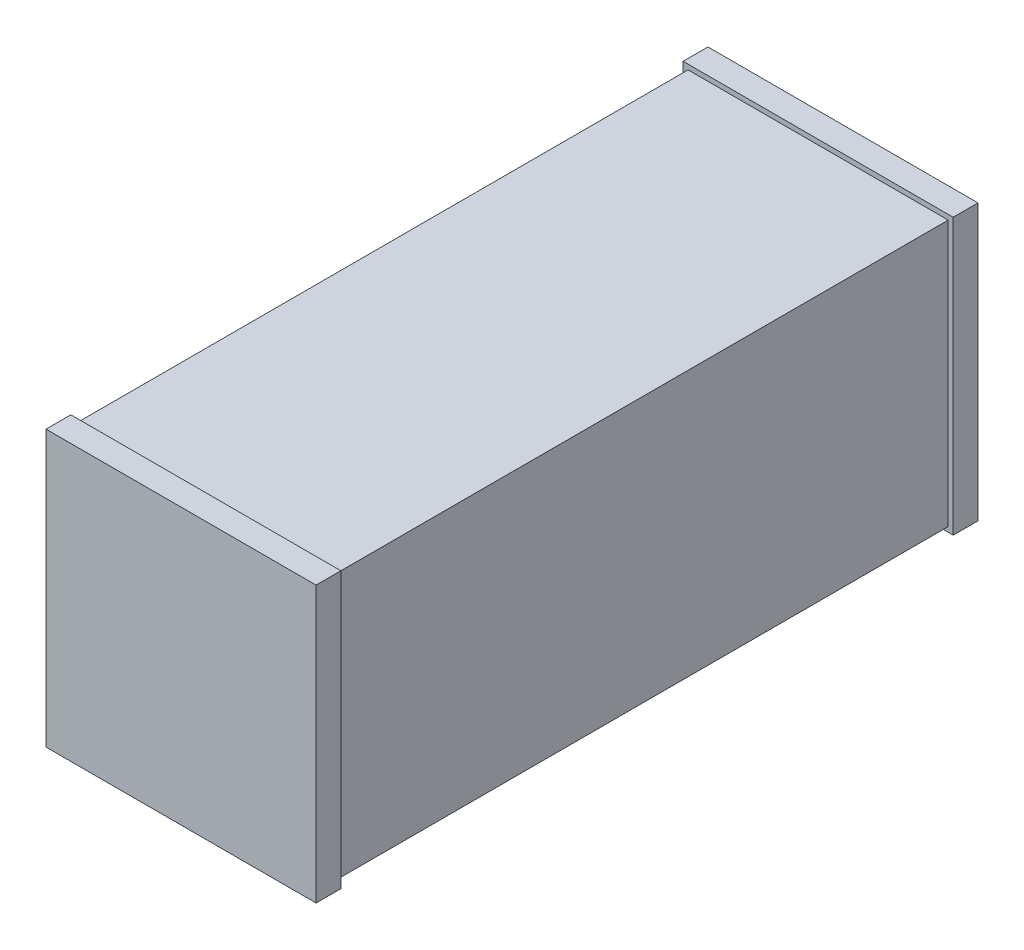
ISO-10303-21;
HEADER;
FILE_DESCRIPTION(('STEP AP214'),'2;1');
FILE_NAME('part.step','',(''),(''),'','','');
FILE_SCHEMA(('AUTOMOTIVE_DESIGN { 1 0 10303 214 1 1 1 1 }'));
ENDSEC;
DATA;
#1=APPLICATION_CONTEXT('core data for automotive mechanical design processes');
#2=APPLICATION_PROTOCOL_DEFINITION('international standard','automotive_design',2000,#1);
#3=PRODUCT_CONTEXT('',#1,'mechanical');
#4=PRODUCT('Part','Part','',(#3));
#5=PRODUCT_RELATED_PRODUCT_CATEGORY('part','',(#4));
#6=PRODUCT_DEFINITION_FORMATION('','',#4);
#7=PRODUCT_DEFINITION_CONTEXT('part definition',#1,'design');
#8=PRODUCT_DEFINITION('design','',#6,#7);
#9=PRODUCT_DEFINITION_SHAPE('','',#8);
#10=(LENGTH_UNIT() NAMED_UNIT(*) SI_UNIT(.MILLI.,.METRE.));
#11=(NAMED_UNIT(*) PLANE_ANGLE_UNIT() SI_UNIT($,.RADIAN.));
#12=(NAMED_UNIT(*) SI_UNIT($,.STERADIAN.) SOLID_ANGLE_UNIT());
#13=UNCERTAINTY_MEASURE_WITH_UNIT(LENGTH_MEASURE(1.E-05),#10,'distance_accuracy_value','');
#14=(GEOMETRIC_REPRESENTATION_CONTEXT(3) GLOBAL_UNCERTAINTY_ASSIGNED_CONTEXT((#13)) GLOBAL_UNIT_ASSIGNED_CONTEXT((#10,
#11,#12)) REPRESENTATION_CONTEXT('',''));
#15=CARTESIAN_POINT('',(0.,0.,0.));
#16=DIRECTION('',(0.,0.,1.));
#17=DIRECTION('',(1.,0.,0.));
#18=AXIS2_PLACEMENT_3D('',#15,#16,#17);
#19=CARTESIAN_POINT('',(0.,0.,-9.525));
#20=DIRECTION('',(0.,0.,1.));
#21=DIRECTION('',(1.,0.,0.));
#22=AXIS2_PLACEMENT_3D('',#19,#20,#21);
#23=PLANE('',#22);
#24=DIRECTION('',(0.,-1.,0.));
#25=VECTOR('',#24,1.);
#26=CARTESIAN_POINT('',(0.,0.,-9.525));
#27=LINE('',#26,#25);
#28=CARTESIAN_POINT('',(0.,0.,-9.525));
#29=VERTEX_POINT('',#28);
#30=CARTESIAN_POINT('',(0.,-105.664,-9.525));
#31=VERTEX_POINT('',#30);
#32=EDGE_CURVE('E237',#29,#31,#27,.T.);
#33=ORIENTED_EDGE('',*,*,#32,.F.);
#34=DIRECTION('',(-1.,0.,0.));
#35=VECTOR('',#34,1.);
#36=CARTESIAN_POINT('',(0.,0.,-9.525));
#37=LINE('',#36,#35);
#38=CARTESIAN_POINT('',(103.632,0.,-9.525));
#39=VERTEX_POINT('',#38);
#40=EDGE_CURVE('E247',#39,#29,#37,.T.);
#41=ORIENTED_EDGE('',*,*,#40,.F.);
#42=DIRECTION('',(0.,1.,0.));
#43=VECTOR('',#42,1.);
#44=CARTESIAN_POINT('',(103.632,0.,-9.525));
#45=LINE('',#44,#43);
#46=CARTESIAN_POINT('',(103.632,-105.664,-9.525));
#47=VERTEX_POINT('',#46);
#48=EDGE_CURVE('E244',#47,#39,#45,.T.);
#49=ORIENTED_EDGE('',*,*,#48,.F.);
#50=DIRECTION('',(1.,0.,0.));
#51=VECTOR('',#50,1.);
#52=CARTESIAN_POINT('',(0.,-105.664,-9.525));
#53=LINE('',#52,#51);
#54=EDGE_CURVE('E240',#31,#47,#53,.T.);
#55=ORIENTED_EDGE('',*,*,#54,.F.);
#56=EDGE_LOOP('',(#33,#41,#49,#55));
#57=FACE_BOUND('',#56,.T.);
#58=DIRECTION('',(0.,-1.,0.));
#59=VECTOR('',#58,1.);
#60=CARTESIAN_POINT('',(101.727,-1.905,-9.525));
#61=LINE('',#60,#59);
#62=CARTESIAN_POINT('',(101.727,-1.905,-9.525));
#63=VERTEX_POINT('',#62);
#64=CARTESIAN_POINT('',(101.727,-103.759,-9.525));
#65=VERTEX_POINT('',#64);
#66=EDGE_CURVE('E61',#63,#65,#61,.T.);
#67=ORIENTED_EDGE('',*,*,#66,.F.);
#68=DIRECTION('',(1.,0.,0.));
#69=VECTOR('',#68,1.);
#70=CARTESIAN_POINT('',(101.727,-1.905,-9.525));
#71=LINE('',#70,#69);
#72=CARTESIAN_POINT('',(1.905,-1.905,-9.525));
#73=VERTEX_POINT('',#72);
#74=EDGE_CURVE('E65',#73,#63,#71,.T.);
#75=ORIENTED_EDGE('',*,*,#74,.F.);
#76=DIRECTION('',(0.,1.,0.));
#77=VECTOR('',#76,1.);
#78=CARTESIAN_POINT('',(1.905,-1.905,-9.525));
#79=LINE('',#78,#77);
#80=CARTESIAN_POINT('',(1.90499999999999,-103.759,-9.525));
#81=VERTEX_POINT('',#80);
#82=EDGE_CURVE('E222',#81,#73,#79,.T.);
#83=ORIENTED_EDGE('',*,*,#82,.F.);
#84=DIRECTION('',(-1.,0.,0.));
#85=VECTOR('',#84,1.);
#86=CARTESIAN_POINT('',(101.727,-103.759,-9.525));
#87=LINE('',#86,#85);
#88=EDGE_CURVE('E219',#65,#81,#87,.T.);
#89=ORIENTED_EDGE('',*,*,#88,.F.);
#90=EDGE_LOOP('',(#67,#75,#83,#89));
#91=FACE_BOUND('',#90,.T.);
#92=ADVANCED_FACE('F44',(#57,#91),#23,.F.);
#93=CARTESIAN_POINT('',(0.,0.,-9.525));
#94=DIRECTION('',(-1.,0.,0.));
#95=DIRECTION('',(0.,-1.,0.));
#96=AXIS2_PLACEMENT_3D('',#93,#94,#95);
#97=PLANE('',#96);
#98=DIRECTION('',(0.,-1.,0.));
#99=VECTOR('',#98,1.);
#100=CARTESIAN_POINT('',(0.,0.,0.));
#101=LINE('',#100,#99);
#102=CARTESIAN_POINT('',(0.,0.,0.));
#103=VERTEX_POINT('',#102);
#104=CARTESIAN_POINT('',(0.,-105.664,0.));
#105=VERTEX_POINT('',#104);
#106=EDGE_CURVE('E236',#103,#105,#101,.T.);
#107=ORIENTED_EDGE('',*,*,#106,.F.);
#108=DIRECTION('',(0.,0.,1.));
#109=VECTOR('',#108,1.);
#110=CARTESIAN_POINT('',(0.,0.,-9.525));
#111=LINE('',#110,#109);
#112=EDGE_CURVE('E11',#29,#103,#111,.T.);
#113=ORIENTED_EDGE('',*,*,#112,.F.);
#114=ORIENTED_EDGE('',*,*,#32,.T.);
#115=DIRECTION('',(0.,0.,1.));
#116=VECTOR('',#115,1.);
#117=CARTESIAN_POINT('',(0.,-105.664,-9.525));
#118=LINE('',#117,#116);
#119=EDGE_CURVE('E48',#31,#105,#118,.T.);
#120=ORIENTED_EDGE('',*,*,#119,.T.);
#121=EDGE_LOOP('',(#107,#113,#114,#120));
#122=FACE_BOUND('',#121,.T.);
#123=ADVANCED_FACE('F46',(#122),#97,.T.);
#124=CARTESIAN_POINT('',(0.,0.,-9.525));
#125=DIRECTION('',(0.,1.,0.));
#126=DIRECTION('',(0.,0.,1.));
#127=AXIS2_PLACEMENT_3D('',#124,#125,#126);
#128=PLANE('',#127);
#129=DIRECTION('',(-1.,0.,0.));
#130=VECTOR('',#129,1.);
#131=CARTESIAN_POINT('',(0.,0.,0.));
#132=LINE('',#131,#130);
#133=CARTESIAN_POINT('',(103.632,0.,0.));
#134=VERTEX_POINT('',#133);
#135=EDGE_CURVE('E241',#134,#103,#132,.T.);
#136=ORIENTED_EDGE('',*,*,#135,.F.);
#137=DIRECTION('',(0.,0.,1.));
#138=VECTOR('',#137,1.);
#139=CARTESIAN_POINT('',(103.632,0.,-9.525));
#140=LINE('',#139,#138);
#141=EDGE_CURVE('E53',#39,#134,#140,.T.);
#142=ORIENTED_EDGE('',*,*,#141,.F.);
#143=ORIENTED_EDGE('',*,*,#40,.T.);
#144=ORIENTED_EDGE('',*,*,#112,.T.);
#145=EDGE_LOOP('',(#136,#142,#143,#144));
#146=FACE_BOUND('',#145,.T.);
#147=ADVANCED_FACE('F273',(#146),#128,.T.);
#148=CARTESIAN_POINT('',(103.632,0.,-9.525));
#149=DIRECTION('',(1.,0.,0.));
#150=DIRECTION('',(0.,1.,0.));
#151=AXIS2_PLACEMENT_3D('',#148,#149,#150);
#152=PLANE('',#151);
#153=DIRECTION('',(0.,1.,0.));
#154=VECTOR('',#153,1.);
#155=CARTESIAN_POINT('',(103.632,0.,0.));
#156=LINE('',#155,#154);
#157=CARTESIAN_POINT('',(103.632,-105.664,0.));
#158=VERTEX_POINT('',#157);
#159=EDGE_CURVE('E255',#158,#134,#156,.T.);
#160=ORIENTED_EDGE('',*,*,#159,.F.);
#161=DIRECTION('',(0.,0.,1.));
#162=VECTOR('',#161,1.);
#163=CARTESIAN_POINT('',(103.632,-105.664,-9.525));
#164=LINE('',#163,#162);
#165=EDGE_CURVE('E260',#47,#158,#164,.T.);
#166=ORIENTED_EDGE('',*,*,#165,.F.);
#167=ORIENTED_EDGE('',*,*,#48,.T.);
#168=ORIENTED_EDGE('',*,*,#141,.T.);
#169=EDGE_LOOP('',(#160,#166,#167,#168));
#170=FACE_BOUND('',#169,.T.);
#171=ADVANCED_FACE('F278',(#170),#152,.T.);
#172=CARTESIAN_POINT('',(0.,-105.664,-9.525));
#173=DIRECTION('',(0.,-1.,0.));
#174=DIRECTION('',(0.,0.,-1.));
#175=AXIS2_PLACEMENT_3D('',#172,#173,#174);
#176=PLANE('',#175);
#177=DIRECTION('',(1.,0.,0.));
#178=VECTOR('',#177,1.);
#179=CARTESIAN_POINT('',(0.,-105.664,0.));
#180=LINE('',#179,#178);
#181=EDGE_CURVE('E252',#105,#158,#180,.T.);
#182=ORIENTED_EDGE('',*,*,#181,.F.);
#183=ORIENTED_EDGE('',*,*,#119,.F.);
#184=ORIENTED_EDGE('',*,*,#54,.T.);
#185=ORIENTED_EDGE('',*,*,#165,.T.);
#186=EDGE_LOOP('',(#182,#183,#184,#185));
#187=FACE_BOUND('',#186,.T.);
#188=ADVANCED_FACE('F268',(#187),#176,.T.);
#189=CARTESIAN_POINT('',(0.,0.,0.));
#190=DIRECTION('',(0.,0.,1.));
#191=DIRECTION('',(1.,0.,0.));
#192=AXIS2_PLACEMENT_3D('',#189,#190,#191);
#193=PLANE('',#192);
#194=ORIENTED_EDGE('',*,*,#106,.T.);
#195=ORIENTED_EDGE('',*,*,#181,.T.);
#196=ORIENTED_EDGE('',*,*,#159,.T.);
#197=ORIENTED_EDGE('',*,*,#135,.T.);
#198=EDGE_LOOP('',(#194,#195,#196,#197));
#199=FACE_BOUND('',#198,.T.);
#200=ADVANCED_FACE('F270',(#199),#193,.T.);
#201=CARTESIAN_POINT('',(101.727,-1.905,-244.475));
#202=DIRECTION('',(-1.,0.,0.));
#203=DIRECTION('',(0.,-1.,0.));
#204=AXIS2_PLACEMENT_3D('',#201,#202,#203);
#205=PLANE('',#204);
#206=ORIENTED_EDGE('',*,*,#66,.T.);
#207=DIRECTION('',(0.,0.,1.));
#208=VECTOR('',#207,1.);
#209=CARTESIAN_POINT('',(101.727,-103.759,-244.475));
#210=LINE('',#209,#208);
#211=CARTESIAN_POINT('',(101.727,-103.759,-244.475));
#212=VERTEX_POINT('',#211);
#213=EDGE_CURVE('E233',#212,#65,#210,.T.);
#214=ORIENTED_EDGE('',*,*,#213,.F.);
#215=DIRECTION('',(0.,-1.,0.));
#216=VECTOR('',#215,1.);
#217=CARTESIAN_POINT('',(101.727,-1.905,-244.475));
#218=LINE('',#217,#216);
#219=CARTESIAN_POINT('',(101.727,-1.905,-244.475));
#220=VERTEX_POINT('',#219);
#221=EDGE_CURVE('E205',#220,#212,#218,.T.);
#222=ORIENTED_EDGE('',*,*,#221,.F.);
#223=DIRECTION('',(0.,0.,1.));
#224=VECTOR('',#223,1.);
#225=CARTESIAN_POINT('',(101.727,-1.905,-244.475));
#226=LINE('',#225,#224);
#227=EDGE_CURVE('E217',#220,#63,#226,.T.);
#228=ORIENTED_EDGE('',*,*,#227,.T.);
#229=EDGE_LOOP('',(#206,#214,#222,#228));
#230=FACE_BOUND('',#229,.T.);
#231=ADVANCED_FACE('F295',(#230),#205,.F.);
#232=CARTESIAN_POINT('',(101.727,-103.759,-244.475));
#233=DIRECTION('',(0.,1.,0.));
#234=DIRECTION('',(0.,0.,1.));
#235=AXIS2_PLACEMENT_3D('',#232,#233,#234);
#236=PLANE('',#235);
#237=CARTESIAN_POINT('',(88.3285,-103.759,-234.95));
#238=DIRECTION('',(0.,-1.,0.));
#239=DIRECTION('',(0.,0.,-1.));
#240=AXIS2_PLACEMENT_3D('',#237,#238,#239);
#241=CIRCLE('',#240,1.35254999999999);
#242=CARTESIAN_POINT('',(88.3285,-103.759,-236.30255));
#243=VERTEX_POINT('',#242);
#244=EDGE_CURVE('E153',#243,#243,#241,.T.);
#245=ORIENTED_EDGE('',*,*,#244,.F.);
#246=EDGE_LOOP('',(#245));
#247=FACE_BOUND('',#246,.T.);
#248=CARTESIAN_POINT('',(15.3035,-103.759,-234.95));
#249=DIRECTION('',(0.,-1.,0.));
#250=DIRECTION('',(0.,0.,-1.));
#251=AXIS2_PLACEMENT_3D('',#248,#249,#250);
#252=CIRCLE('',#251,1.35254999999999);
#253=CARTESIAN_POINT('',(15.3035,-103.759,-236.30255));
#254=VERTEX_POINT('',#253);
#255=EDGE_CURVE('E152',#254,#254,#252,.T.);
#256=ORIENTED_EDGE('',*,*,#255,.F.);
#257=EDGE_LOOP('',(#256));
#258=FACE_BOUND('',#257,.T.);
#259=CARTESIAN_POINT('',(88.3285,-103.759,-19.05));
#260=DIRECTION('',(0.,-1.,0.));
#261=DIRECTION('',(0.,0.,-1.));
#262=AXIS2_PLACEMENT_3D('',#259,#260,#261);
#263=CIRCLE('',#262,1.35254999999999);
#264=CARTESIAN_POINT('',(88.3285,-103.759,-20.40255));
#265=VERTEX_POINT('',#264);
#266=EDGE_CURVE('E163',#265,#265,#263,.T.);
#267=ORIENTED_EDGE('',*,*,#266,.F.);
#268=EDGE_LOOP('',(#267));
#269=FACE_BOUND('',#268,.T.);
#270=CARTESIAN_POINT('',(15.3035,-103.759,-19.05));
#271=DIRECTION('',(0.,-1.,0.));
#272=DIRECTION('',(0.,0.,-1.));
#273=AXIS2_PLACEMENT_3D('',#270,#271,#272);
#274=CIRCLE('',#273,1.35254999999999);
#275=CARTESIAN_POINT('',(15.3035,-103.759,-20.40255));
#276=VERTEX_POINT('',#275);
#277=EDGE_CURVE('E169',#276,#276,#274,.T.);
#278=ORIENTED_EDGE('',*,*,#277,.F.);
#279=EDGE_LOOP('',(#278));
#280=FACE_BOUND('',#279,.T.);
#281=ORIENTED_EDGE('',*,*,#88,.T.);
#282=DIRECTION('',(0.,0.,1.));
#283=VECTOR('',#282,1.);
#284=CARTESIAN_POINT('',(1.90499999999999,-103.759,-244.475));
#285=LINE('',#284,#283);
#286=CARTESIAN_POINT('',(1.90499999999999,-103.759,-244.475));
#287=VERTEX_POINT('',#286);
#288=EDGE_CURVE('E230',#287,#81,#285,.T.);
#289=ORIENTED_EDGE('',*,*,#288,.F.);
#290=DIRECTION('',(-1.,0.,0.));
#291=VECTOR('',#290,1.);
#292=CARTESIAN_POINT('',(101.727,-103.759,-244.475));
#293=LINE('',#292,#291);
#294=EDGE_CURVE('E208',#212,#287,#293,.T.);
#295=ORIENTED_EDGE('',*,*,#294,.F.);
#296=ORIENTED_EDGE('',*,*,#213,.T.);
#297=EDGE_LOOP('',(#281,#289,#295,#296));
#298=FACE_BOUND('',#297,.T.);
#299=ADVANCED_FACE('F299',(#247,#258,#269,#280,#298),#236,.F.);
#300=CARTESIAN_POINT('',(1.905,-1.905,-244.475));
#301=DIRECTION('',(1.,0.,0.));
#302=DIRECTION('',(0.,1.,0.));
#303=AXIS2_PLACEMENT_3D('',#300,#301,#302);
#304=PLANE('',#303);
#305=ORIENTED_EDGE('',*,*,#82,.T.);
#306=DIRECTION('',(0.,0.,1.));
#307=VECTOR('',#306,1.);
#308=CARTESIAN_POINT('',(1.905,-1.905,-244.475));
#309=LINE('',#308,#307);
#310=CARTESIAN_POINT('',(1.905,-1.905,-244.475));
#311=VERTEX_POINT('',#310);
#312=EDGE_CURVE('E227',#311,#73,#309,.T.);
#313=ORIENTED_EDGE('',*,*,#312,.F.);
#314=DIRECTION('',(0.,1.,0.));
#315=VECTOR('',#314,1.);
#316=CARTESIAN_POINT('',(1.905,-1.905,-244.475));
#317=LINE('',#316,#315);
#318=EDGE_CURVE('E211',#287,#311,#317,.T.);
#319=ORIENTED_EDGE('',*,*,#318,.F.);
#320=ORIENTED_EDGE('',*,*,#288,.T.);
#321=EDGE_LOOP('',(#305,#313,#319,#320));
#322=FACE_BOUND('',#321,.T.);
#323=ADVANCED_FACE('F305',(#322),#304,.F.);
#324=CARTESIAN_POINT('',(101.727,-1.905,-244.475));
#325=DIRECTION('',(0.,-1.,0.));
#326=DIRECTION('',(0.,0.,-1.));
#327=AXIS2_PLACEMENT_3D('',#324,#325,#326);
#328=PLANE('',#327);
#329=ORIENTED_EDGE('',*,*,#74,.T.);
#330=ORIENTED_EDGE('',*,*,#227,.F.);
#331=DIRECTION('',(1.,0.,0.));
#332=VECTOR('',#331,1.);
#333=CARTESIAN_POINT('',(101.727,-1.905,-244.475));
#334=LINE('',#333,#332);
#335=EDGE_CURVE('E214',#311,#220,#334,.T.);
#336=ORIENTED_EDGE('',*,*,#335,.F.);
#337=ORIENTED_EDGE('',*,*,#312,.T.);
#338=EDGE_LOOP('',(#329,#330,#336,#337));
#339=FACE_BOUND('',#338,.T.);
#340=ADVANCED_FACE('F311',(#339),#328,.F.);
#341=CARTESIAN_POINT('',(0.,0.,-244.475));
#342=DIRECTION('',(0.,0.,-1.));
#343=DIRECTION('',(-1.,0.,0.));
#344=AXIS2_PLACEMENT_3D('',#341,#342,#343);
#345=PLANE('',#344);
#346=DIRECTION('',(0.,1.,0.));
#347=VECTOR('',#346,1.);
#348=CARTESIAN_POINT('',(0.,-105.664,-244.475));
#349=LINE('',#348,#347);
#350=CARTESIAN_POINT('',(0.,-105.664,-244.475));
#351=VERTEX_POINT('',#350);
#352=CARTESIAN_POINT('',(0.,0.,-244.475));
#353=VERTEX_POINT('',#352);
#354=EDGE_CURVE('E175',#351,#353,#349,.T.);
#355=ORIENTED_EDGE('',*,*,#354,.F.);
#356=DIRECTION('',(-1.,0.,0.));
#357=VECTOR('',#356,1.);
#358=CARTESIAN_POINT('',(103.632,-105.664,-244.475));
#359=LINE('',#358,#357);
#360=CARTESIAN_POINT('',(103.632,-105.664,-244.475));
#361=VERTEX_POINT('',#360);
#362=EDGE_CURVE('E180',#361,#351,#359,.T.);
#363=ORIENTED_EDGE('',*,*,#362,.F.);
#364=DIRECTION('',(0.,-1.,0.));
#365=VECTOR('',#364,1.);
#366=CARTESIAN_POINT('',(103.632,0.,-244.475));
#367=LINE('',#366,#365);
#368=CARTESIAN_POINT('',(103.632,0.,-244.475));
#369=VERTEX_POINT('',#368);
#370=EDGE_CURVE('E191',#369,#361,#367,.T.);
#371=ORIENTED_EDGE('',*,*,#370,.F.);
#372=DIRECTION('',(1.,0.,0.));
#373=VECTOR('',#372,1.);
#374=CARTESIAN_POINT('',(0.,0.,-244.475));
#375=LINE('',#374,#373);
#376=EDGE_CURVE('E189',#353,#369,#375,.T.);
#377=ORIENTED_EDGE('',*,*,#376,.F.);
#378=EDGE_LOOP('',(#355,#363,#371,#377));
#379=FACE_BOUND('',#378,.T.);
#380=ORIENTED_EDGE('',*,*,#335,.T.);
#381=ORIENTED_EDGE('',*,*,#221,.T.);
#382=ORIENTED_EDGE('',*,*,#294,.T.);
#383=ORIENTED_EDGE('',*,*,#318,.T.);
#384=EDGE_LOOP('',(#380,#381,#382,#383));
#385=FACE_BOUND('',#384,.T.);
#386=ADVANCED_FACE('F313',(#379,#385),#345,.F.);
#387=CARTESIAN_POINT('',(0.,-105.664,-254.));
#388=DIRECTION('',(1.,0.,0.));
#389=DIRECTION('',(0.,1.,0.));
#390=AXIS2_PLACEMENT_3D('',#387,#388,#389);
#391=PLANE('',#390);
#392=ORIENTED_EDGE('',*,*,#354,.T.);
#393=DIRECTION('',(0.,0.,1.));
#394=VECTOR('',#393,1.);
#395=CARTESIAN_POINT('',(0.,0.,-254.));
#396=LINE('',#395,#394);
#397=CARTESIAN_POINT('',(0.,0.,-254.));
#398=VERTEX_POINT('',#397);
#399=EDGE_CURVE('E202',#398,#353,#396,.T.);
#400=ORIENTED_EDGE('',*,*,#399,.F.);
#401=DIRECTION('',(0.,1.,0.));
#402=VECTOR('',#401,1.);
#403=CARTESIAN_POINT('',(0.,-105.664,-254.));
#404=LINE('',#403,#402);
#405=CARTESIAN_POINT('',(0.,-105.664,-254.));
#406=VERTEX_POINT('',#405);
#407=EDGE_CURVE('E176',#406,#398,#404,.T.);
#408=ORIENTED_EDGE('',*,*,#407,.F.);
#409=DIRECTION('',(0.,0.,1.));
#410=VECTOR('',#409,1.);
#411=CARTESIAN_POINT('',(0.,-105.664,-254.));
#412=LINE('',#411,#410);
#413=EDGE_CURVE('E186',#406,#351,#412,.T.);
#414=ORIENTED_EDGE('',*,*,#413,.T.);
#415=EDGE_LOOP('',(#392,#400,#408,#414));
#416=FACE_BOUND('',#415,.T.);
#417=ADVANCED_FACE('F323',(#416),#391,.F.);
#418=CARTESIAN_POINT('',(0.,0.,-254.));
#419=DIRECTION('',(0.,-1.,0.));
#420=DIRECTION('',(0.,0.,-1.));
#421=AXIS2_PLACEMENT_3D('',#418,#419,#420);
#422=PLANE('',#421);
#423=ORIENTED_EDGE('',*,*,#376,.T.);
#424=DIRECTION('',(0.,0.,1.));
#425=VECTOR('',#424,1.);
#426=CARTESIAN_POINT('',(103.632,0.,-254.));
#427=LINE('',#426,#425);
#428=CARTESIAN_POINT('',(103.632,0.,-254.));
#429=VERTEX_POINT('',#428);
#430=EDGE_CURVE('E199',#429,#369,#427,.T.);
#431=ORIENTED_EDGE('',*,*,#430,.F.);
#432=DIRECTION('',(1.,0.,0.));
#433=VECTOR('',#432,1.);
#434=CARTESIAN_POINT('',(0.,0.,-254.));
#435=LINE('',#434,#433);
#436=EDGE_CURVE('E179',#398,#429,#435,.T.);
#437=ORIENTED_EDGE('',*,*,#436,.F.);
#438=ORIENTED_EDGE('',*,*,#399,.T.);
#439=EDGE_LOOP('',(#423,#431,#437,#438));
#440=FACE_BOUND('',#439,.T.);
#441=ADVANCED_FACE('F326',(#440),#422,.F.);
#442=CARTESIAN_POINT('',(103.632,0.,-254.));
#443=DIRECTION('',(-1.,0.,0.));
#444=DIRECTION('',(0.,-1.,0.));
#445=AXIS2_PLACEMENT_3D('',#442,#443,#444);
#446=PLANE('',#445);
#447=ORIENTED_EDGE('',*,*,#370,.T.);
#448=DIRECTION('',(0.,0.,1.));
#449=VECTOR('',#448,1.);
#450=CARTESIAN_POINT('',(103.632,-105.664,-254.));
#451=LINE('',#450,#449);
#452=CARTESIAN_POINT('',(103.632,-105.664,-254.));
#453=VERTEX_POINT('',#452);
#454=EDGE_CURVE('E196',#453,#361,#451,.T.);
#455=ORIENTED_EDGE('',*,*,#454,.F.);
#456=DIRECTION('',(0.,-1.,0.));
#457=VECTOR('',#456,1.);
#458=CARTESIAN_POINT('',(103.632,0.,-254.));
#459=LINE('',#458,#457);
#460=EDGE_CURVE('E182',#429,#453,#459,.T.);
#461=ORIENTED_EDGE('',*,*,#460,.F.);
#462=ORIENTED_EDGE('',*,*,#430,.T.);
#463=EDGE_LOOP('',(#447,#455,#461,#462));
#464=FACE_BOUND('',#463,.T.);
#465=ADVANCED_FACE('F330',(#464),#446,.F.);
#466=CARTESIAN_POINT('',(103.632,-105.664,-254.));
#467=DIRECTION('',(0.,1.,0.));
#468=DIRECTION('',(0.,0.,1.));
#469=AXIS2_PLACEMENT_3D('',#466,#467,#468);
#470=PLANE('',#469);
#471=ORIENTED_EDGE('',*,*,#362,.T.);
#472=ORIENTED_EDGE('',*,*,#413,.F.);
#473=DIRECTION('',(-1.,0.,0.));
#474=VECTOR('',#473,1.);
#475=CARTESIAN_POINT('',(103.632,-105.664,-254.));
#476=LINE('',#475,#474);
#477=EDGE_CURVE('E184',#453,#406,#476,.T.);
#478=ORIENTED_EDGE('',*,*,#477,.F.);
#479=ORIENTED_EDGE('',*,*,#454,.T.);
#480=EDGE_LOOP('',(#471,#472,#478,#479));
#481=FACE_BOUND('',#480,.T.);
#482=ADVANCED_FACE('F334',(#481),#470,.F.);
#483=CARTESIAN_POINT('',(0.,0.,-254.));
#484=DIRECTION('',(0.,0.,-1.));
#485=DIRECTION('',(-1.,0.,0.));
#486=AXIS2_PLACEMENT_3D('',#483,#484,#485);
#487=PLANE('',#486);
#488=ORIENTED_EDGE('',*,*,#407,.T.);
#489=ORIENTED_EDGE('',*,*,#436,.T.);
#490=ORIENTED_EDGE('',*,*,#460,.T.);
#491=ORIENTED_EDGE('',*,*,#477,.T.);
#492=EDGE_LOOP('',(#488,#489,#490,#491));
#493=FACE_BOUND('',#492,.T.);
#494=ADVANCED_FACE('F338',(#493),#487,.T.);
#495=CARTESIAN_POINT('',(15.3035,-99.78898,-19.05));
#496=DIRECTION('',(0.,-1.,0.));
#497=DIRECTION('',(0.,0.,-1.));
#498=AXIS2_PLACEMENT_3D('',#495,#496,#497);
#499=CONICAL_SURFACE('',#498,1.35255,1.02974425867665);
#500=CARTESIAN_POINT('',(15.3035,-98.9762859697343,-19.05));
#501=VERTEX_POINT('',#500);
#502=VERTEX_LOOP('',#501);
#503=FACE_BOUND('',#502,.T.);
#504=CARTESIAN_POINT('',(15.3035,-99.78898,-19.05));
#505=DIRECTION('',(0.,-1.,0.));
#506=DIRECTION('',(0.,0.,-1.));
#507=AXIS2_PLACEMENT_3D('',#504,#505,#506);
#508=CIRCLE('',#507,1.35255);
#509=CARTESIAN_POINT('',(15.3035,-99.78898,-20.40255));
#510=VERTEX_POINT('',#509);
#511=EDGE_CURVE('E172',#510,#510,#508,.T.);
#512=ORIENTED_EDGE('',*,*,#511,.T.);
#513=EDGE_LOOP('',(#512));
#514=FACE_BOUND('',#513,.T.);
#515=ADVANCED_FACE('F345',(#503,#514),#499,.F.);
#516=CARTESIAN_POINT('',(15.3035,-103.759,-19.05));
#517=DIRECTION('',(0.,-1.,0.));
#518=DIRECTION('',(0.,0.,-1.));
#519=AXIS2_PLACEMENT_3D('',#516,#517,#518);
#520=CYLINDRICAL_SURFACE('',#519,1.35254999999999);
#521=ORIENTED_EDGE('',*,*,#511,.F.);
#522=EDGE_LOOP('',(#521));
#523=FACE_BOUND('',#522,.T.);
#524=ORIENTED_EDGE('',*,*,#277,.T.);
#525=EDGE_LOOP('',(#524));
#526=FACE_BOUND('',#525,.T.);
#527=ADVANCED_FACE('F349',(#523,#526),#520,.F.);
#528=CARTESIAN_POINT('',(88.3285,-99.78898,-19.05));
#529=DIRECTION('',(0.,-1.,0.));
#530=DIRECTION('',(0.,0.,-1.));
#531=AXIS2_PLACEMENT_3D('',#528,#529,#530);
#532=CONICAL_SURFACE('',#531,1.35254999999999,1.02974425867665);
#533=CARTESIAN_POINT('',(88.3285,-98.9762859697343,-19.05));
#534=VERTEX_POINT('',#533);
#535=VERTEX_LOOP('',#534);
#536=FACE_BOUND('',#535,.T.);
#537=CARTESIAN_POINT('',(88.3285,-99.78898,-19.05));
#538=DIRECTION('',(0.,-1.,0.));
#539=DIRECTION('',(0.,0.,-1.));
#540=AXIS2_PLACEMENT_3D('',#537,#538,#539);
#541=CIRCLE('',#540,1.35254999999999);
#542=CARTESIAN_POINT('',(88.3285,-99.78898,-20.40255));
#543=VERTEX_POINT('',#542);
#544=EDGE_CURVE('E166',#543,#543,#541,.T.);
#545=ORIENTED_EDGE('',*,*,#544,.T.);
#546=EDGE_LOOP('',(#545));
#547=FACE_BOUND('',#546,.T.);
#548=ADVANCED_FACE('F353',(#536,#547),#532,.F.);
#549=CARTESIAN_POINT('',(88.3285,-103.759,-19.05));
#550=DIRECTION('',(0.,-1.,0.));
#551=DIRECTION('',(0.,0.,-1.));
#552=AXIS2_PLACEMENT_3D('',#549,#550,#551);
#553=CYLINDRICAL_SURFACE('',#552,1.35254999999999);
#554=ORIENTED_EDGE('',*,*,#544,.F.);
#555=EDGE_LOOP('',(#554));
#556=FACE_BOUND('',#555,.T.);
#557=ORIENTED_EDGE('',*,*,#266,.T.);
#558=EDGE_LOOP('',(#557));
#559=FACE_BOUND('',#558,.T.);
#560=ADVANCED_FACE('F357',(#556,#559),#553,.F.);
#561=CARTESIAN_POINT('',(15.3035,-99.78898,-234.95));
#562=DIRECTION('',(0.,-1.,0.));
#563=DIRECTION('',(0.,0.,-1.));
#564=AXIS2_PLACEMENT_3D('',#561,#562,#563);
#565=CONICAL_SURFACE('',#564,1.35255,1.02974425867665);
#566=CARTESIAN_POINT('',(15.3035,-98.9762859697343,-234.95));
#567=VERTEX_POINT('',#566);
#568=VERTEX_LOOP('',#567);
#569=FACE_BOUND('',#568,.T.);
#570=CARTESIAN_POINT('',(15.3035,-99.78898,-234.95));
#571=DIRECTION('',(0.,-1.,0.));
#572=DIRECTION('',(0.,0.,-1.));
#573=AXIS2_PLACEMENT_3D('',#570,#571,#572);
#574=CIRCLE('',#573,1.35255);
#575=CARTESIAN_POINT('',(15.3035,-99.78898,-236.30255));
#576=VERTEX_POINT('',#575);
#577=EDGE_CURVE('E156',#576,#576,#574,.T.);
#578=ORIENTED_EDGE('',*,*,#577,.T.);
#579=EDGE_LOOP('',(#578));
#580=FACE_BOUND('',#579,.T.);
#581=ADVANCED_FACE('F361',(#569,#580),#565,.F.);
#582=CARTESIAN_POINT('',(15.3035,-103.759,-234.95));
#583=DIRECTION('',(0.,-1.,0.));
#584=DIRECTION('',(0.,0.,-1.));
#585=AXIS2_PLACEMENT_3D('',#582,#583,#584);
#586=CYLINDRICAL_SURFACE('',#585,1.35254999999999);
#587=ORIENTED_EDGE('',*,*,#577,.F.);
#588=EDGE_LOOP('',(#587));
#589=FACE_BOUND('',#588,.T.);
#590=ORIENTED_EDGE('',*,*,#255,.T.);
#591=EDGE_LOOP('',(#590));
#592=FACE_BOUND('',#591,.T.);
#593=ADVANCED_FACE('F146',(#589,#592),#586,.F.);
#594=CARTESIAN_POINT('',(88.3285,-99.78898,-234.95));
#595=DIRECTION('',(0.,-1.,0.));
#596=DIRECTION('',(0.,0.,-1.));
#597=AXIS2_PLACEMENT_3D('',#594,#595,#596);
#598=CONICAL_SURFACE('',#597,1.35254999999999,1.02974425867665);
#599=CARTESIAN_POINT('',(88.3285,-98.9762859697343,-234.95));
#600=VERTEX_POINT('',#599);
#601=VERTEX_LOOP('',#600);
#602=FACE_BOUND('',#601,.T.);
#603=CARTESIAN_POINT('',(88.3285,-99.78898,-234.95));
#604=DIRECTION('',(0.,-1.,0.));
#605=DIRECTION('',(0.,0.,-1.));
#606=AXIS2_PLACEMENT_3D('',#603,#604,#605);
#607=CIRCLE('',#606,1.35254999999999);
#608=CARTESIAN_POINT('',(88.3285,-99.78898,-236.30255));
#609=VERTEX_POINT('',#608);
#610=EDGE_CURVE('E150',#609,#609,#607,.T.);
#611=ORIENTED_EDGE('',*,*,#610,.T.);
#612=EDGE_LOOP('',(#611));
#613=FACE_BOUND('',#612,.T.);
#614=ADVANCED_FACE('F142',(#602,#613),#598,.F.);
#615=CARTESIAN_POINT('',(88.3285,-103.759,-234.95));
#616=DIRECTION('',(0.,-1.,0.));
#617=DIRECTION('',(0.,0.,-1.));
#618=AXIS2_PLACEMENT_3D('',#615,#616,#617);
#619=CYLINDRICAL_SURFACE('',#618,1.35254999999999);
#620=ORIENTED_EDGE('',*,*,#610,.F.);
#621=EDGE_LOOP('',(#620));
#622=FACE_BOUND('',#621,.T.);
#623=ORIENTED_EDGE('',*,*,#244,.T.);
#624=EDGE_LOOP('',(#623));
#625=FACE_BOUND('',#624,.T.);
#626=ADVANCED_FACE('F145',(#622,#625),#619,.F.);
#627=CLOSED_SHELL('',(#92,#123,#147,#171,#188,#200,#231,#299,#323,#340,#386,#417,#441,#465,#482,
#494,#515,#527,#548,#560,#581,#593,#614,#626));
#628=MANIFOLD_SOLID_BREP('B2',#627);
#629=ADVANCED_BREP_SHAPE_REPRESENTATION('',(#18,#628),#14);
#630=SHAPE_DEFINITION_REPRESENTATION(#9,#629);
ENDSEC;
END-ISO-10303-21;
